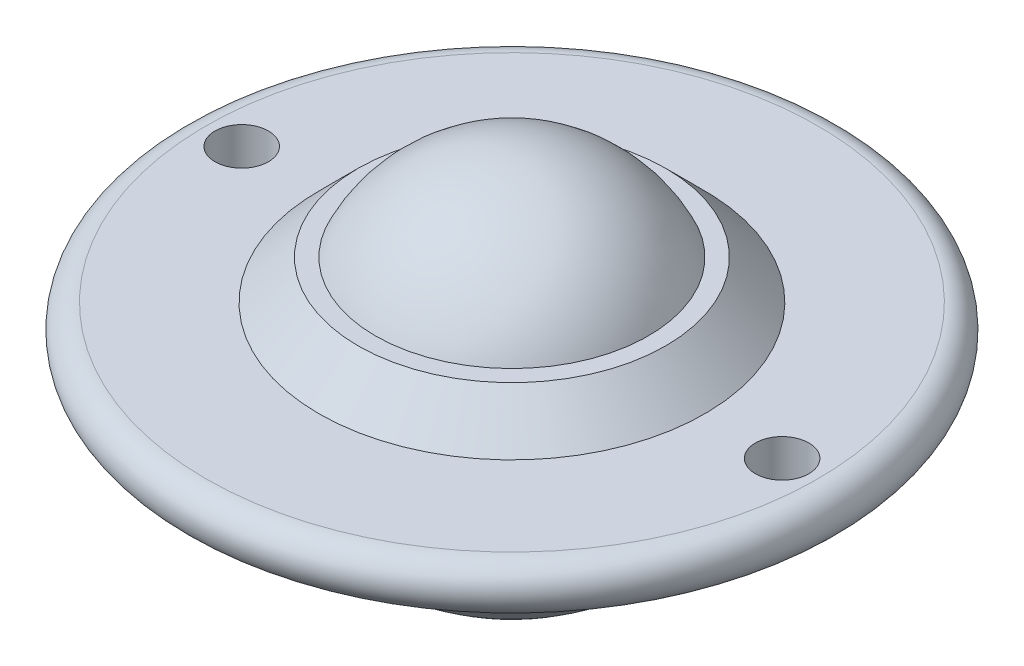
ISO-10303-21;
HEADER;
FILE_DESCRIPTION(('STEP AP214'),'2;1');
FILE_NAME('part.step','',(''),(''),'','','');
FILE_SCHEMA(('AUTOMOTIVE_DESIGN { 1 0 10303 214 1 1 1 1 }'));
ENDSEC;
DATA;
#1=APPLICATION_CONTEXT('core data for automotive mechanical design processes');
#2=APPLICATION_PROTOCOL_DEFINITION('international standard','automotive_design',2000,#1);
#3=PRODUCT_CONTEXT('',#1,'mechanical');
#4=PRODUCT('Part','Part','',(#3));
#5=PRODUCT_RELATED_PRODUCT_CATEGORY('part','',(#4));
#6=PRODUCT_DEFINITION_FORMATION('','',#4);
#7=PRODUCT_DEFINITION_CONTEXT('part definition',#1,'design');
#8=PRODUCT_DEFINITION('design','',#6,#7);
#9=PRODUCT_DEFINITION_SHAPE('','',#8);
#10=(LENGTH_UNIT() NAMED_UNIT(*) SI_UNIT(.MILLI.,.METRE.));
#11=(NAMED_UNIT(*) PLANE_ANGLE_UNIT() SI_UNIT($,.RADIAN.));
#12=(NAMED_UNIT(*) SI_UNIT($,.STERADIAN.) SOLID_ANGLE_UNIT());
#13=UNCERTAINTY_MEASURE_WITH_UNIT(LENGTH_MEASURE(1.E-05),#10,'distance_accuracy_value','');
#14=(GEOMETRIC_REPRESENTATION_CONTEXT(3) GLOBAL_UNCERTAINTY_ASSIGNED_CONTEXT((#13)) GLOBAL_UNIT_ASSIGNED_CONTEXT((#10,
#11,#12)) REPRESENTATION_CONTEXT('',''));
#15=CARTESIAN_POINT('',(0.,0.,0.));
#16=DIRECTION('',(0.,0.,1.));
#17=DIRECTION('',(1.,0.,0.));
#18=AXIS2_PLACEMENT_3D('',#15,#16,#17);
#19=CARTESIAN_POINT('',(0.,0.,0.));
#20=DIRECTION('',(0.,1.,0.));
#21=DIRECTION('',(0.,0.,1.));
#22=AXIS2_PLACEMENT_3D('',#19,#20,#21);
#23=TOROIDAL_SURFACE('',#22,25.75,2.00000000000001);
#24=CARTESIAN_POINT('',(0.,-2.,0.));
#25=DIRECTION('',(0.,1.,0.));
#26=DIRECTION('',(0.,0.,1.));
#27=AXIS2_PLACEMENT_3D('',#24,#25,#26);
#28=CIRCLE('',#27,25.75);
#29=CARTESIAN_POINT('',(0.,-2.,25.75));
#30=VERTEX_POINT('',#29);
#31=EDGE_CURVE('E10',#30,#30,#28,.T.);
#32=ORIENTED_EDGE('',*,*,#31,.T.);
#33=EDGE_LOOP('',(#32));
#34=FACE_BOUND('',#33,.T.);
#35=CARTESIAN_POINT('',(0.,2.00000000000002,0.));
#36=DIRECTION('',(0.,1.,0.));
#37=DIRECTION('',(0.,0.,1.));
#38=AXIS2_PLACEMENT_3D('',#35,#36,#37);
#39=CIRCLE('',#38,25.75);
#40=CARTESIAN_POINT('',(0.,2.00000000000002,25.75));
#41=VERTEX_POINT('',#40);
#42=EDGE_CURVE('E50',#41,#41,#39,.T.);
#43=ORIENTED_EDGE('',*,*,#42,.F.);
#44=EDGE_LOOP('',(#43));
#45=FACE_BOUND('',#44,.T.);
#46=ADVANCED_FACE('F33',(#34,#45),#23,.T.);
#47=CARTESIAN_POINT('',(-25.75,-2.,0.));
#48=DIRECTION('',(0.,-1.,0.));
#49=DIRECTION('',(0.,0.,-1.));
#50=AXIS2_PLACEMENT_3D('',#47,#48,#49);
#51=PLANE('',#50);
#52=CARTESIAN_POINT('',(22.75,-2.,0.));
#53=DIRECTION('',(0.,-1.,0.));
#54=DIRECTION('',(0.,0.,1.));
#55=AXIS2_PLACEMENT_3D('',#52,#53,#54);
#56=CIRCLE('',#55,2.25);
#57=CARTESIAN_POINT('',(22.75,-2.,2.25));
#58=VERTEX_POINT('',#57);
#59=EDGE_CURVE('E62',#58,#58,#56,.T.);
#60=ORIENTED_EDGE('',*,*,#59,.F.);
#61=EDGE_LOOP('',(#60));
#62=FACE_BOUND('',#61,.T.);
#63=CARTESIAN_POINT('',(-22.75,-2.,0.));
#64=DIRECTION('',(0.,-1.,0.));
#65=DIRECTION('',(0.,0.,-1.));
#66=AXIS2_PLACEMENT_3D('',#63,#64,#65);
#67=CIRCLE('',#66,2.25);
#68=CARTESIAN_POINT('',(-22.75,-2.,-2.25));
#69=VERTEX_POINT('',#68);
#70=EDGE_CURVE('E51',#69,#69,#67,.T.);
#71=ORIENTED_EDGE('',*,*,#70,.F.);
#72=EDGE_LOOP('',(#71));
#73=FACE_BOUND('',#72,.T.);
#74=CARTESIAN_POINT('',(0.,-1.99999999999999,0.));
#75=DIRECTION('',(0.,1.,0.));
#76=DIRECTION('',(0.,0.,1.));
#77=AXIS2_PLACEMENT_3D('',#74,#75,#76);
#78=CIRCLE('',#77,17.3481987537612);
#79=CARTESIAN_POINT('',(0.,-1.99999999999999,17.3481987537612));
#80=VERTEX_POINT('',#79);
#81=EDGE_CURVE('E40',#80,#80,#78,.T.);
#82=ORIENTED_EDGE('',*,*,#81,.T.);
#83=EDGE_LOOP('',(#82));
#84=FACE_BOUND('',#83,.T.);
#85=ORIENTED_EDGE('',*,*,#31,.F.);
#86=EDGE_LOOP('',(#85));
#87=FACE_BOUND('',#86,.T.);
#88=ADVANCED_FACE('F89',(#62,#73,#84,#87),#51,.T.);
#89=CARTESIAN_POINT('',(0.,0.300000000000002,0.));
#90=DIRECTION('',(0.,1.,0.));
#91=DIRECTION('',(-1.,0.,0.));
#92=AXIS2_PLACEMENT_3D('',#89,#90,#91);
#93=SPHERICAL_SURFACE('',#92,17.5);
#94=ORIENTED_EDGE('',*,*,#81,.F.);
#95=EDGE_LOOP('',(#94));
#96=FACE_BOUND('',#95,.T.);
#97=ADVANCED_FACE('F86',(#96),#93,.T.);
#98=CARTESIAN_POINT('',(0.,-0.0999999999999994,0.));
#99=DIRECTION('',(0.,1.,0.));
#100=DIRECTION('',(-1.,0.,0.));
#101=AXIS2_PLACEMENT_3D('',#98,#99,#100);
#102=SPHERICAL_SURFACE('',#101,12.7);
#103=CARTESIAN_POINT('',(0.,5.3,0.));
#104=DIRECTION('',(0.,1.,0.));
#105=DIRECTION('',(0.,0.,1.));
#106=AXIS2_PLACEMENT_3D('',#103,#104,#105);
#107=CIRCLE('',#106,11.4947814246292);
#108=CARTESIAN_POINT('',(0.,5.3,11.4947814246292));
#109=VERTEX_POINT('',#108);
#110=EDGE_CURVE('E45',#109,#109,#107,.T.);
#111=ORIENTED_EDGE('',*,*,#110,.T.);
#112=EDGE_LOOP('',(#111));
#113=FACE_BOUND('',#112,.T.);
#114=ADVANCED_FACE('F72',(#113),#102,.T.);
#115=CARTESIAN_POINT('',(-12.95,5.3,0.));
#116=DIRECTION('',(0.,1.,0.));
#117=DIRECTION('',(0.,0.,1.));
#118=AXIS2_PLACEMENT_3D('',#115,#116,#117);
#119=PLANE('',#118);
#120=CARTESIAN_POINT('',(0.,5.3,0.));
#121=DIRECTION('',(0.,1.,0.));
#122=DIRECTION('',(0.,0.,1.));
#123=AXIS2_PLACEMENT_3D('',#120,#121,#122);
#124=CIRCLE('',#123,12.95);
#125=CARTESIAN_POINT('',(0.,5.3,12.95));
#126=VERTEX_POINT('',#125);
#127=EDGE_CURVE('E67',#126,#126,#124,.T.);
#128=ORIENTED_EDGE('',*,*,#127,.T.);
#129=EDGE_LOOP('',(#128));
#130=FACE_BOUND('',#129,.T.);
#131=ORIENTED_EDGE('',*,*,#110,.F.);
#132=EDGE_LOOP('',(#131));
#133=FACE_BOUND('',#132,.T.);
#134=ADVANCED_FACE('F74',(#130,#133),#119,.T.);
#135=CARTESIAN_POINT('',(0.,5.3,0.));
#136=DIRECTION('',(0.,-1.,0.));
#137=DIRECTION('',(0.,0.,-1.));
#138=AXIS2_PLACEMENT_3D('',#135,#136,#137);
#139=CONICAL_SURFACE('',#138,12.95,0.785398163397448);
#140=CARTESIAN_POINT('',(0.,2.00000000000001,0.));
#141=DIRECTION('',(0.,1.,0.));
#142=DIRECTION('',(0.,0.,1.));
#143=AXIS2_PLACEMENT_3D('',#140,#141,#142);
#144=CIRCLE('',#143,16.25);
#145=CARTESIAN_POINT('',(0.,2.00000000000001,16.25));
#146=VERTEX_POINT('',#145);
#147=EDGE_CURVE('E55',#146,#146,#144,.T.);
#148=ORIENTED_EDGE('',*,*,#147,.T.);
#149=EDGE_LOOP('',(#148));
#150=FACE_BOUND('',#149,.T.);
#151=ORIENTED_EDGE('',*,*,#127,.F.);
#152=EDGE_LOOP('',(#151));
#153=FACE_BOUND('',#152,.T.);
#154=ADVANCED_FACE('F76',(#150,#153),#139,.T.);
#155=CARTESIAN_POINT('',(-25.75,2.00000000000001,0.));
#156=DIRECTION('',(0.,1.,0.));
#157=DIRECTION('',(0.,0.,1.));
#158=AXIS2_PLACEMENT_3D('',#155,#156,#157);
#159=PLANE('',#158);
#160=CARTESIAN_POINT('',(22.75,2.00000000000002,0.));
#161=DIRECTION('',(0.,1.,0.));
#162=DIRECTION('',(0.,0.,1.));
#163=AXIS2_PLACEMENT_3D('',#160,#161,#162);
#164=CIRCLE('',#163,2.25);
#165=CARTESIAN_POINT('',(22.75,2.00000000000002,2.25));
#166=VERTEX_POINT('',#165);
#167=EDGE_CURVE('E36',#166,#166,#164,.T.);
#168=ORIENTED_EDGE('',*,*,#167,.F.);
#169=EDGE_LOOP('',(#168));
#170=FACE_BOUND('',#169,.T.);
#171=CARTESIAN_POINT('',(-22.75,2.00000000000002,0.));
#172=DIRECTION('',(0.,1.,0.));
#173=DIRECTION('',(0.,0.,1.));
#174=AXIS2_PLACEMENT_3D('',#171,#172,#173);
#175=CIRCLE('',#174,2.25);
#176=CARTESIAN_POINT('',(-22.75,2.00000000000002,2.25));
#177=VERTEX_POINT('',#176);
#178=EDGE_CURVE('E48',#177,#177,#175,.T.);
#179=ORIENTED_EDGE('',*,*,#178,.F.);
#180=EDGE_LOOP('',(#179));
#181=FACE_BOUND('',#180,.T.);
#182=ORIENTED_EDGE('',*,*,#42,.T.);
#183=EDGE_LOOP('',(#182));
#184=FACE_BOUND('',#183,.T.);
#185=ORIENTED_EDGE('',*,*,#147,.F.);
#186=EDGE_LOOP('',(#185));
#187=FACE_BOUND('',#186,.T.);
#188=ADVANCED_FACE('F83',(#170,#181,#184,#187),#159,.T.);
#189=CARTESIAN_POINT('',(-22.75,12.6,0.));
#190=DIRECTION('',(0.,-1.,0.));
#191=DIRECTION('',(0.,0.,-1.));
#192=AXIS2_PLACEMENT_3D('',#189,#190,#191);
#193=CYLINDRICAL_SURFACE('',#192,2.25);
#194=ORIENTED_EDGE('',*,*,#178,.T.);
#195=EDGE_LOOP('',(#194));
#196=FACE_BOUND('',#195,.T.);
#197=ORIENTED_EDGE('',*,*,#70,.T.);
#198=EDGE_LOOP('',(#197));
#199=FACE_BOUND('',#198,.T.);
#200=ADVANCED_FACE('F99',(#196,#199),#193,.F.);
#201=CARTESIAN_POINT('',(22.75,12.6,0.));
#202=DIRECTION('',(0.,-1.,0.));
#203=DIRECTION('',(0.,0.,-1.));
#204=AXIS2_PLACEMENT_3D('',#201,#202,#203);
#205=CYLINDRICAL_SURFACE('',#204,2.25);
#206=ORIENTED_EDGE('',*,*,#167,.T.);
#207=EDGE_LOOP('',(#206));
#208=FACE_BOUND('',#207,.T.);
#209=ORIENTED_EDGE('',*,*,#59,.T.);
#210=EDGE_LOOP('',(#209));
#211=FACE_BOUND('',#210,.T.);
#212=ADVANCED_FACE('F108',(#208,#211),#205,.F.);
#213=CLOSED_SHELL('',(#46,#88,#97,#114,#134,#154,#188,#200,#212));
#214=MANIFOLD_SOLID_BREP('B2',#213);
#215=ADVANCED_BREP_SHAPE_REPRESENTATION('',(#18,#214),#14);
#216=SHAPE_DEFINITION_REPRESENTATION(#9,#215);
ENDSEC;
END-ISO-10303-21;
